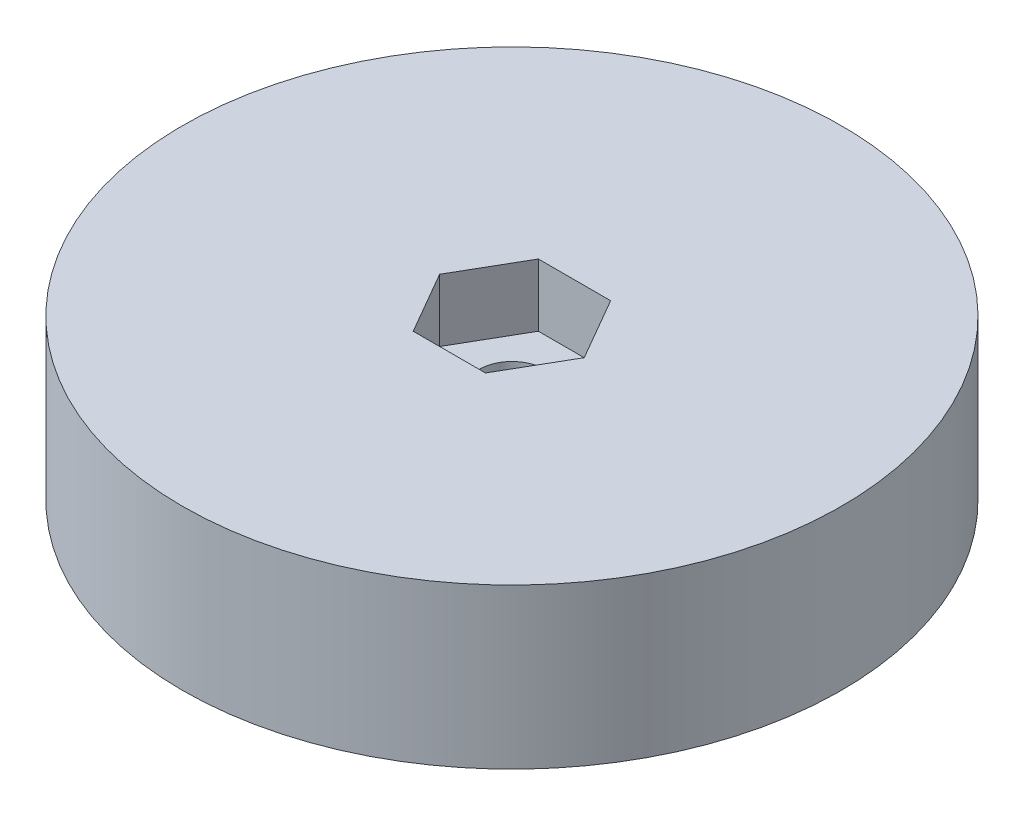
ISO-10303-21;
HEADER;
FILE_DESCRIPTION(('STEP AP214'),'2;1');
FILE_NAME('part.step','',(''),(''),'','','');
FILE_SCHEMA(('AUTOMOTIVE_DESIGN { 1 0 10303 214 1 1 1 1 }'));
ENDSEC;
DATA;
#1=APPLICATION_CONTEXT('core data for automotive mechanical design processes');
#2=APPLICATION_PROTOCOL_DEFINITION('international standard','automotive_design',2000,#1);
#3=PRODUCT_CONTEXT('',#1,'mechanical');
#4=PRODUCT('Part','Part','',(#3));
#5=PRODUCT_RELATED_PRODUCT_CATEGORY('part','',(#4));
#6=PRODUCT_DEFINITION_FORMATION('','',#4);
#7=PRODUCT_DEFINITION_CONTEXT('part definition',#1,'design');
#8=PRODUCT_DEFINITION('design','',#6,#7);
#9=PRODUCT_DEFINITION_SHAPE('','',#8);
#10=(LENGTH_UNIT() NAMED_UNIT(*) SI_UNIT(.MILLI.,.METRE.));
#11=(NAMED_UNIT(*) PLANE_ANGLE_UNIT() SI_UNIT($,.RADIAN.));
#12=(NAMED_UNIT(*) SI_UNIT($,.STERADIAN.) SOLID_ANGLE_UNIT());
#13=UNCERTAINTY_MEASURE_WITH_UNIT(LENGTH_MEASURE(1.E-05),#10,'distance_accuracy_value','');
#14=(GEOMETRIC_REPRESENTATION_CONTEXT(3) GLOBAL_UNCERTAINTY_ASSIGNED_CONTEXT((#13)) GLOBAL_UNIT_ASSIGNED_CONTEXT((#10,
#11,#12)) REPRESENTATION_CONTEXT('',''));
#15=CARTESIAN_POINT('',(0.,0.,0.));
#16=DIRECTION('',(0.,0.,1.));
#17=DIRECTION('',(1.,0.,0.));
#18=AXIS2_PLACEMENT_3D('',#15,#16,#17);
#19=CARTESIAN_POINT('',(0.,5.5,-24.));
#20=DIRECTION('',(0.,-1.,0.));
#21=DIRECTION('',(0.,0.,-1.));
#22=AXIS2_PLACEMENT_3D('',#19,#20,#21);
#23=CYLINDRICAL_SURFACE('',#22,1.5);
#24=CARTESIAN_POINT('',(0.,5.5,-24.));
#25=DIRECTION('',(0.,1.,0.));
#26=DIRECTION('',(0.,0.,1.));
#27=AXIS2_PLACEMENT_3D('',#24,#25,#26);
#28=CIRCLE('',#27,1.5);
#29=CARTESIAN_POINT('',(1.23097770997243,5.5,-24.8571428571429));
#30=VERTEX_POINT('',#29);
#31=CARTESIAN_POINT('',(-0.857142857142857,5.5,-22.7690222900276));
#32=VERTEX_POINT('',#31);
#33=EDGE_CURVE('E272',#30,#32,#28,.T.);
#34=ORIENTED_EDGE('',*,*,#33,.T.);
#35=DIRECTION('',(0.,-1.,0.));
#36=VECTOR('',#35,1.);
#37=CARTESIAN_POINT('',(-0.857142857142857,5.5,-22.7690222900276));
#38=LINE('',#37,#36);
#39=CARTESIAN_POINT('',(-0.857142857142857,0.,-22.7690222900276));
#40=VERTEX_POINT('',#39);
#41=EDGE_CURVE('E421',#32,#40,#38,.T.);
#42=ORIENTED_EDGE('',*,*,#41,.T.);
#43=CARTESIAN_POINT('',(0.,0.,-24.));
#44=DIRECTION('',(0.,1.,0.));
#45=DIRECTION('',(0.,0.,1.));
#46=AXIS2_PLACEMENT_3D('',#43,#44,#45);
#47=CIRCLE('',#46,1.5);
#48=CARTESIAN_POINT('',(1.23097770997243,0.,-24.8571428571429));
#49=VERTEX_POINT('',#48);
#50=EDGE_CURVE('E308',#49,#40,#47,.T.);
#51=ORIENTED_EDGE('',*,*,#50,.F.);
#52=DIRECTION('',(0.,-1.,0.));
#53=VECTOR('',#52,1.);
#54=CARTESIAN_POINT('',(1.23097770997244,5.5,-24.8571428571429));
#55=LINE('',#54,#53);
#56=EDGE_CURVE('E419',#49,#30,#55,.F.);
#57=ORIENTED_EDGE('',*,*,#56,.T.);
#58=EDGE_LOOP('',(#34,#42,#51,#57));
#59=FACE_BOUND('',#58,.T.);
#60=ADVANCED_FACE('F37',(#59),#23,.F.);
#61=CARTESIAN_POINT('',(0.,5.5,-24.));
#62=DIRECTION('',(0.,0.,-1.));
#63=DIRECTION('',(-1.,0.,0.));
#64=AXIS2_PLACEMENT_3D('',#61,#62,#63);
#65=PLANE('',#64);
#66=DIRECTION('',(1.,0.,0.));
#67=VECTOR('',#66,1.);
#68=CARTESIAN_POINT('',(0.,5.5,-24.));
#69=LINE('',#68,#67);
#70=CARTESIAN_POINT('',(2.87228132326901,5.5,-24.));
#71=VERTEX_POINT('',#70);
#72=CARTESIAN_POINT('',(9.75,5.5,-24.));
#73=VERTEX_POINT('',#72);
#74=EDGE_CURVE('E274',#71,#73,#69,.T.);
#75=ORIENTED_EDGE('',*,*,#74,.F.);
#76=DIRECTION('',(0.,1.,0.));
#77=VECTOR('',#76,1.);
#78=CARTESIAN_POINT('',(2.87228132326901,0.,-24.));
#79=LINE('',#78,#77);
#80=CARTESIAN_POINT('',(2.87228132326901,0.,-24.));
#81=VERTEX_POINT('',#80);
#82=EDGE_CURVE('E11',#71,#81,#79,.F.);
#83=ORIENTED_EDGE('',*,*,#82,.T.);
#84=DIRECTION('',(1.,0.,0.));
#85=VECTOR('',#84,1.);
#86=CARTESIAN_POINT('',(0.,0.,-24.));
#87=LINE('',#86,#85);
#88=CARTESIAN_POINT('',(9.75,0.,-24.));
#89=VERTEX_POINT('',#88);
#90=EDGE_CURVE('E311',#81,#89,#87,.T.);
#91=ORIENTED_EDGE('',*,*,#90,.T.);
#92=DIRECTION('',(0.,-1.,0.));
#93=VECTOR('',#92,1.);
#94=CARTESIAN_POINT('',(9.75,5.5,-24.));
#95=LINE('',#94,#93);
#96=EDGE_CURVE('E347',#73,#89,#95,.T.);
#97=ORIENTED_EDGE('',*,*,#96,.F.);
#98=EDGE_LOOP('',(#75,#83,#91,#97));
#99=FACE_BOUND('',#98,.T.);
#100=ADVANCED_FACE('F499',(#99),#65,.F.);
#101=CARTESIAN_POINT('',(9.75,5.5,0.));
#102=DIRECTION('',(-1.,0.,0.));
#103=DIRECTION('',(0.,0.,1.));
#104=AXIS2_PLACEMENT_3D('',#101,#102,#103);
#105=PLANE('',#104);
#106=DIRECTION('',(0.,0.,-1.));
#107=VECTOR('',#106,1.);
#108=CARTESIAN_POINT('',(9.75,0.,0.));
#109=LINE('',#108,#107);
#110=CARTESIAN_POINT('',(9.75,0.,-28.5));
#111=VERTEX_POINT('',#110);
#112=EDGE_CURVE('E313',#89,#111,#109,.T.);
#113=ORIENTED_EDGE('',*,*,#112,.T.);
#114=DIRECTION('',(0.,-1.,0.));
#115=VECTOR('',#114,1.);
#116=CARTESIAN_POINT('',(9.75,5.5,-28.5));
#117=LINE('',#116,#115);
#118=CARTESIAN_POINT('',(9.75,5.5,-28.5));
#119=VERTEX_POINT('',#118);
#120=EDGE_CURVE('E344',#119,#111,#117,.T.);
#121=ORIENTED_EDGE('',*,*,#120,.F.);
#122=DIRECTION('',(0.,0.,-1.));
#123=VECTOR('',#122,1.);
#124=CARTESIAN_POINT('',(9.75,5.5,0.));
#125=LINE('',#124,#123);
#126=EDGE_CURVE('E278',#73,#119,#125,.T.);
#127=ORIENTED_EDGE('',*,*,#126,.F.);
#128=ORIENTED_EDGE('',*,*,#96,.T.);
#129=EDGE_LOOP('',(#113,#121,#127,#128));
#130=FACE_BOUND('',#129,.T.);
#131=ADVANCED_FACE('F503',(#130),#105,.F.);
#132=CARTESIAN_POINT('',(0.,5.5,-28.5));
#133=DIRECTION('',(0.,0.,-1.));
#134=DIRECTION('',(-1.,0.,0.));
#135=AXIS2_PLACEMENT_3D('',#132,#133,#134);
#136=PLANE('',#135);
#137=DIRECTION('',(1.,0.,0.));
#138=VECTOR('',#137,1.);
#139=CARTESIAN_POINT('',(0.,0.,-28.5));
#140=LINE('',#139,#138);
#141=CARTESIAN_POINT('',(14.25,0.,-28.5));
#142=VERTEX_POINT('',#141);
#143=EDGE_CURVE('E316',#111,#142,#140,.T.);
#144=ORIENTED_EDGE('',*,*,#143,.T.);
#145=DIRECTION('',(0.,-1.,0.));
#146=VECTOR('',#145,1.);
#147=CARTESIAN_POINT('',(14.25,5.5,-28.5));
#148=LINE('',#147,#146);
#149=CARTESIAN_POINT('',(14.25,5.5,-28.5));
#150=VERTEX_POINT('',#149);
#151=EDGE_CURVE('E342',#150,#142,#148,.T.);
#152=ORIENTED_EDGE('',*,*,#151,.F.);
#153=DIRECTION('',(1.,0.,0.));
#154=VECTOR('',#153,1.);
#155=CARTESIAN_POINT('',(0.,5.5,-28.5));
#156=LINE('',#155,#154);
#157=EDGE_CURVE('E281',#119,#150,#156,.T.);
#158=ORIENTED_EDGE('',*,*,#157,.F.);
#159=ORIENTED_EDGE('',*,*,#120,.T.);
#160=EDGE_LOOP('',(#144,#152,#158,#159));
#161=FACE_BOUND('',#160,.T.);
#162=ADVANCED_FACE('F505',(#161),#136,.F.);
#163=CARTESIAN_POINT('',(14.25,5.5,0.));
#164=DIRECTION('',(-1.,0.,0.));
#165=DIRECTION('',(0.,0.,1.));
#166=AXIS2_PLACEMENT_3D('',#163,#164,#165);
#167=PLANE('',#166);
#168=DIRECTION('',(0.,0.,-1.));
#169=VECTOR('',#168,1.);
#170=CARTESIAN_POINT('',(14.25,0.,0.));
#171=LINE('',#170,#169);
#172=CARTESIAN_POINT('',(14.25,0.,-24.));
#173=VERTEX_POINT('',#172);
#174=EDGE_CURVE('E319',#173,#142,#171,.T.);
#175=ORIENTED_EDGE('',*,*,#174,.F.);
#176=DIRECTION('',(0.,-1.,0.));
#177=VECTOR('',#176,1.);
#178=CARTESIAN_POINT('',(14.25,5.5,-24.));
#179=LINE('',#178,#177);
#180=CARTESIAN_POINT('',(14.25,5.5,-24.));
#181=VERTEX_POINT('',#180);
#182=EDGE_CURVE('E305',#181,#173,#179,.T.);
#183=ORIENTED_EDGE('',*,*,#182,.F.);
#184=DIRECTION('',(0.,0.,-1.));
#185=VECTOR('',#184,1.);
#186=CARTESIAN_POINT('',(14.25,5.5,0.));
#187=LINE('',#186,#185);
#188=EDGE_CURVE('E284',#181,#150,#187,.T.);
#189=ORIENTED_EDGE('',*,*,#188,.T.);
#190=ORIENTED_EDGE('',*,*,#151,.T.);
#191=EDGE_LOOP('',(#175,#183,#189,#190));
#192=FACE_BOUND('',#191,.T.);
#193=ADVANCED_FACE('F439',(#192),#167,.T.);
#194=CARTESIAN_POINT('',(0.,5.5,-24.));
#195=DIRECTION('',(0.,0.,1.));
#196=DIRECTION('',(1.,0.,0.));
#197=AXIS2_PLACEMENT_3D('',#194,#195,#196);
#198=PLANE('',#197);
#199=DIRECTION('',(-1.,0.,0.));
#200=VECTOR('',#199,1.);
#201=CARTESIAN_POINT('',(0.,0.,-24.));
#202=LINE('',#201,#200);
#203=CARTESIAN_POINT('',(21.127718676731,0.,-24.));
#204=VERTEX_POINT('',#203);
#205=EDGE_CURVE('E322',#204,#173,#202,.T.);
#206=ORIENTED_EDGE('',*,*,#205,.F.);
#207=DIRECTION('',(0.,1.,0.));
#208=VECTOR('',#207,1.);
#209=CARTESIAN_POINT('',(21.127718676731,5.5,-24.));
#210=LINE('',#209,#208);
#211=CARTESIAN_POINT('',(21.127718676731,5.5,-24.));
#212=VERTEX_POINT('',#211);
#213=EDGE_CURVE('E46',#204,#212,#210,.T.);
#214=ORIENTED_EDGE('',*,*,#213,.T.);
#215=DIRECTION('',(-1.,0.,0.));
#216=VECTOR('',#215,1.);
#217=CARTESIAN_POINT('',(0.,5.5,-24.));
#218=LINE('',#217,#216);
#219=EDGE_CURVE('E287',#212,#181,#218,.T.);
#220=ORIENTED_EDGE('',*,*,#219,.T.);
#221=ORIENTED_EDGE('',*,*,#182,.T.);
#222=EDGE_LOOP('',(#206,#214,#220,#221));
#223=FACE_BOUND('',#222,.T.);
#224=ADVANCED_FACE('F428',(#223),#198,.T.);
#225=CARTESIAN_POINT('',(24.,5.5,-24.));
#226=DIRECTION('',(0.,-1.,0.));
#227=DIRECTION('',(0.,0.,-1.));
#228=AXIS2_PLACEMENT_3D('',#225,#226,#227);
#229=CYLINDRICAL_SURFACE('',#228,1.5);
#230=CARTESIAN_POINT('',(24.,0.,-24.));
#231=DIRECTION('',(0.,1.,0.));
#232=DIRECTION('',(0.,0.,1.));
#233=AXIS2_PLACEMENT_3D('',#230,#231,#232);
#234=CIRCLE('',#233,1.5);
#235=CARTESIAN_POINT('',(22.7690222900276,0.,-24.8571428571429));
#236=VERTEX_POINT('',#235);
#237=CARTESIAN_POINT('',(24.8571428571429,0.,-22.7690222900276));
#238=VERTEX_POINT('',#237);
#239=EDGE_CURVE('E324',#236,#238,#234,.F.);
#240=ORIENTED_EDGE('',*,*,#239,.T.);
#241=DIRECTION('',(0.,-1.,0.));
#242=VECTOR('',#241,1.);
#243=CARTESIAN_POINT('',(24.8571428571429,5.5,-22.7690222900276));
#244=LINE('',#243,#242);
#245=CARTESIAN_POINT('',(24.8571428571429,5.5,-22.7690222900276));
#246=VERTEX_POINT('',#245);
#247=EDGE_CURVE('E408',#238,#246,#244,.F.);
#248=ORIENTED_EDGE('',*,*,#247,.T.);
#249=CARTESIAN_POINT('',(24.,5.5,-24.));
#250=DIRECTION('',(0.,1.,0.));
#251=DIRECTION('',(0.,0.,1.));
#252=AXIS2_PLACEMENT_3D('',#249,#250,#251);
#253=CIRCLE('',#252,1.5);
#254=CARTESIAN_POINT('',(22.7690222900276,5.5,-24.8571428571429));
#255=VERTEX_POINT('',#254);
#256=EDGE_CURVE('E289',#255,#246,#253,.F.);
#257=ORIENTED_EDGE('',*,*,#256,.F.);
#258=DIRECTION('',(0.,-1.,0.));
#259=VECTOR('',#258,1.);
#260=CARTESIAN_POINT('',(22.7690222900276,5.5,-24.8571428571429));
#261=LINE('',#260,#259);
#262=EDGE_CURVE('E405',#255,#236,#261,.T.);
#263=ORIENTED_EDGE('',*,*,#262,.T.);
#264=EDGE_LOOP('',(#240,#248,#257,#263));
#265=FACE_BOUND('',#264,.T.);
#266=ADVANCED_FACE('F445',(#265),#229,.F.);
#267=CARTESIAN_POINT('',(24.,5.5,0.));
#268=DIRECTION('',(-1.,0.,0.));
#269=DIRECTION('',(0.,0.,1.));
#270=AXIS2_PLACEMENT_3D('',#267,#268,#269);
#271=PLANE('',#270);
#272=DIRECTION('',(0.,0.,-1.));
#273=VECTOR('',#272,1.);
#274=CARTESIAN_POINT('',(24.,0.,0.));
#275=LINE('',#274,#273);
#276=CARTESIAN_POINT('',(24.,0.,-2.87228132326901));
#277=VERTEX_POINT('',#276);
#278=CARTESIAN_POINT('',(24.,0.,-21.127718676731));
#279=VERTEX_POINT('',#278);
#280=EDGE_CURVE('E327',#277,#279,#275,.T.);
#281=ORIENTED_EDGE('',*,*,#280,.F.);
#282=DIRECTION('',(0.,1.,0.));
#283=VECTOR('',#282,1.);
#284=CARTESIAN_POINT('',(24.,5.5,-2.87228132326901));
#285=LINE('',#284,#283);
#286=CARTESIAN_POINT('',(24.,5.5,-2.87228132326901));
#287=VERTEX_POINT('',#286);
#288=EDGE_CURVE('E403',#277,#287,#285,.T.);
#289=ORIENTED_EDGE('',*,*,#288,.T.);
#290=DIRECTION('',(0.,0.,-1.));
#291=VECTOR('',#290,1.);
#292=CARTESIAN_POINT('',(24.,5.5,0.));
#293=LINE('',#292,#291);
#294=CARTESIAN_POINT('',(24.,5.5,-21.127718676731));
#295=VERTEX_POINT('',#294);
#296=EDGE_CURVE('E292',#287,#295,#293,.T.);
#297=ORIENTED_EDGE('',*,*,#296,.T.);
#298=DIRECTION('',(0.,1.,0.));
#299=VECTOR('',#298,1.);
#300=CARTESIAN_POINT('',(24.,0.,-21.127718676731));
#301=LINE('',#300,#299);
#302=EDGE_CURVE('E400',#295,#279,#301,.F.);
#303=ORIENTED_EDGE('',*,*,#302,.T.);
#304=EDGE_LOOP('',(#281,#289,#297,#303));
#305=FACE_BOUND('',#304,.T.);
#306=ADVANCED_FACE('F454',(#305),#271,.T.);
#307=CARTESIAN_POINT('',(24.,5.5,0.));
#308=DIRECTION('',(0.,-1.,0.));
#309=DIRECTION('',(0.,0.,-1.));
#310=AXIS2_PLACEMENT_3D('',#307,#308,#309);
#311=CYLINDRICAL_SURFACE('',#310,1.5);
#312=CARTESIAN_POINT('',(24.,0.,0.));
#313=DIRECTION('',(0.,1.,0.));
#314=DIRECTION('',(0.,0.,1.));
#315=AXIS2_PLACEMENT_3D('',#312,#313,#314);
#316=CIRCLE('',#315,1.5);
#317=CARTESIAN_POINT('',(24.8571428571429,0.,-1.23097770997243));
#318=VERTEX_POINT('',#317);
#319=CARTESIAN_POINT('',(22.7690222900276,0.,0.857142857142857));
#320=VERTEX_POINT('',#319);
#321=EDGE_CURVE('E330',#318,#320,#316,.F.);
#322=ORIENTED_EDGE('',*,*,#321,.T.);
#323=DIRECTION('',(0.,-1.,0.));
#324=VECTOR('',#323,1.);
#325=CARTESIAN_POINT('',(22.7690222900276,5.5,0.857142857142857));
#326=LINE('',#325,#324);
#327=CARTESIAN_POINT('',(22.7690222900276,5.5,0.857142857142857));
#328=VERTEX_POINT('',#327);
#329=EDGE_CURVE('E374',#320,#328,#326,.F.);
#330=ORIENTED_EDGE('',*,*,#329,.T.);
#331=CARTESIAN_POINT('',(24.,5.5,0.));
#332=DIRECTION('',(0.,1.,0.));
#333=DIRECTION('',(0.,0.,1.));
#334=AXIS2_PLACEMENT_3D('',#331,#332,#333);
#335=CIRCLE('',#334,1.5);
#336=CARTESIAN_POINT('',(24.8571428571429,5.5,-1.23097770997243));
#337=VERTEX_POINT('',#336);
#338=EDGE_CURVE('E294',#337,#328,#335,.F.);
#339=ORIENTED_EDGE('',*,*,#338,.F.);
#340=DIRECTION('',(0.,-1.,0.));
#341=VECTOR('',#340,1.);
#342=CARTESIAN_POINT('',(24.8571428571429,5.5,-1.23097770997243));
#343=LINE('',#342,#341);
#344=EDGE_CURVE('E371',#337,#318,#343,.T.);
#345=ORIENTED_EDGE('',*,*,#344,.T.);
#346=EDGE_LOOP('',(#322,#330,#339,#345));
#347=FACE_BOUND('',#346,.T.);
#348=ADVANCED_FACE('F462',(#347),#311,.F.);
#349=CARTESIAN_POINT('',(0.,5.5,0.));
#350=DIRECTION('',(0.,0.,-1.));
#351=DIRECTION('',(-1.,0.,0.));
#352=AXIS2_PLACEMENT_3D('',#349,#350,#351);
#353=PLANE('',#352);
#354=DIRECTION('',(1.,0.,0.));
#355=VECTOR('',#354,1.);
#356=CARTESIAN_POINT('',(0.,5.5,0.));
#357=LINE('',#356,#355);
#358=CARTESIAN_POINT('',(2.87228132326901,5.5,0.));
#359=VERTEX_POINT('',#358);
#360=CARTESIAN_POINT('',(21.127718676731,5.5,0.));
#361=VERTEX_POINT('',#360);
#362=EDGE_CURVE('E297',#359,#361,#357,.T.);
#363=ORIENTED_EDGE('',*,*,#362,.T.);
#364=DIRECTION('',(0.,1.,0.));
#365=VECTOR('',#364,1.);
#366=CARTESIAN_POINT('',(21.127718676731,0.,0.));
#367=LINE('',#366,#365);
#368=CARTESIAN_POINT('',(21.127718676731,0.,0.));
#369=VERTEX_POINT('',#368);
#370=EDGE_CURVE('E352',#361,#369,#367,.F.);
#371=ORIENTED_EDGE('',*,*,#370,.T.);
#372=DIRECTION('',(1.,0.,0.));
#373=VECTOR('',#372,1.);
#374=CARTESIAN_POINT('',(0.,0.,0.));
#375=LINE('',#374,#373);
#376=CARTESIAN_POINT('',(2.87228132326901,0.,0.));
#377=VERTEX_POINT('',#376);
#378=EDGE_CURVE('E333',#377,#369,#375,.T.);
#379=ORIENTED_EDGE('',*,*,#378,.F.);
#380=DIRECTION('',(0.,1.,0.));
#381=VECTOR('',#380,1.);
#382=CARTESIAN_POINT('',(2.87228132326901,5.5,0.));
#383=LINE('',#382,#381);
#384=EDGE_CURVE('E350',#377,#359,#383,.T.);
#385=ORIENTED_EDGE('',*,*,#384,.T.);
#386=EDGE_LOOP('',(#363,#371,#379,#385));
#387=FACE_BOUND('',#386,.T.);
#388=ADVANCED_FACE('F471',(#387),#353,.T.);
#389=CARTESIAN_POINT('',(0.,5.5,0.));
#390=DIRECTION('',(0.,-1.,0.));
#391=DIRECTION('',(0.,0.,-1.));
#392=AXIS2_PLACEMENT_3D('',#389,#390,#391);
#393=CYLINDRICAL_SURFACE('',#392,1.5);
#394=CARTESIAN_POINT('',(0.,0.,0.));
#395=DIRECTION('',(0.,1.,0.));
#396=DIRECTION('',(0.,0.,1.));
#397=AXIS2_PLACEMENT_3D('',#394,#395,#396);
#398=CIRCLE('',#397,1.5);
#399=CARTESIAN_POINT('',(1.23097770997243,0.,0.857142857142857));
#400=VERTEX_POINT('',#399);
#401=CARTESIAN_POINT('',(-0.857142857142857,0.,-1.23097770997243));
#402=VERTEX_POINT('',#401);
#403=EDGE_CURVE('E336',#400,#402,#398,.F.);
#404=ORIENTED_EDGE('',*,*,#403,.T.);
#405=DIRECTION('',(0.,-1.,0.));
#406=VECTOR('',#405,1.);
#407=CARTESIAN_POINT('',(-0.857142857142857,5.5,-1.23097770997243));
#408=LINE('',#407,#406);
#409=CARTESIAN_POINT('',(-0.857142857142857,5.5,-1.23097770997243));
#410=VERTEX_POINT('',#409);
#411=EDGE_CURVE('E417',#402,#410,#408,.F.);
#412=ORIENTED_EDGE('',*,*,#411,.T.);
#413=CARTESIAN_POINT('',(0.,5.5,0.));
#414=DIRECTION('',(0.,1.,0.));
#415=DIRECTION('',(0.,0.,1.));
#416=AXIS2_PLACEMENT_3D('',#413,#414,#415);
#417=CIRCLE('',#416,1.5);
#418=CARTESIAN_POINT('',(1.23097770997243,5.5,0.857142857142857));
#419=VERTEX_POINT('',#418);
#420=EDGE_CURVE('E299',#419,#410,#417,.F.);
#421=ORIENTED_EDGE('',*,*,#420,.F.);
#422=DIRECTION('',(0.,-1.,0.));
#423=VECTOR('',#422,1.);
#424=CARTESIAN_POINT('',(1.23097770997243,5.5,0.857142857142857));
#425=LINE('',#424,#423);
#426=EDGE_CURVE('E414',#419,#400,#425,.T.);
#427=ORIENTED_EDGE('',*,*,#426,.T.);
#428=EDGE_LOOP('',(#404,#412,#421,#427));
#429=FACE_BOUND('',#428,.T.);
#430=ADVANCED_FACE('F479',(#429),#393,.F.);
#431=CARTESIAN_POINT('',(12.,5.5,-12.));
#432=DIRECTION('',(0.,-1.,0.));
#433=DIRECTION('',(0.,0.,-1.));
#434=AXIS2_PLACEMENT_3D('',#431,#432,#433);
#435=CYLINDRICAL_SURFACE('',#434,22.1147575161927);
#436=CARTESIAN_POINT('',(12.,0.,-12.));
#437=DIRECTION('',(0.,1.,0.));
#438=DIRECTION('',(0.,0.,1.));
#439=AXIS2_PLACEMENT_3D('',#436,#437,#438);
#440=CIRCLE('',#439,22.1147575161927);
#441=CARTESIAN_POINT('',(12.,0.,10.1147575161927));
#442=VERTEX_POINT('',#441);
#443=EDGE_CURVE('E271',#442,#442,#440,.F.);
#444=ORIENTED_EDGE('',*,*,#443,.F.);
#445=EDGE_LOOP('',(#444));
#446=FACE_BOUND('',#445,.T.);
#447=CARTESIAN_POINT('',(12.,10.7,-12.));
#448=DIRECTION('',(0.,1.,0.));
#449=DIRECTION('',(0.,0.,1.));
#450=AXIS2_PLACEMENT_3D('',#447,#448,#449);
#451=CIRCLE('',#450,22.1147575161927);
#452=CARTESIAN_POINT('',(12.,10.7,10.1147575161927));
#453=VERTEX_POINT('',#452);
#454=EDGE_CURVE('E261',#453,#453,#451,.T.);
#455=ORIENTED_EDGE('',*,*,#454,.F.);
#456=EDGE_LOOP('',(#455));
#457=FACE_BOUND('',#456,.T.);
#458=ADVANCED_FACE('F521',(#446,#457),#435,.T.);
#459=CARTESIAN_POINT('',(0.,5.5,0.));
#460=DIRECTION('',(-1.,0.,0.));
#461=DIRECTION('',(0.,0.,1.));
#462=AXIS2_PLACEMENT_3D('',#459,#460,#461);
#463=PLANE('',#462);
#464=DIRECTION('',(0.,0.,-1.));
#465=VECTOR('',#464,1.);
#466=CARTESIAN_POINT('',(0.,5.5,0.));
#467=LINE('',#466,#465);
#468=CARTESIAN_POINT('',(0.,5.5,-2.87228132326901));
#469=VERTEX_POINT('',#468);
#470=CARTESIAN_POINT('',(0.,5.5,-21.127718676731));
#471=VERTEX_POINT('',#470);
#472=EDGE_CURVE('E302',#469,#471,#467,.T.);
#473=ORIENTED_EDGE('',*,*,#472,.F.);
#474=DIRECTION('',(0.,-1.,0.));
#475=VECTOR('',#474,1.);
#476=CARTESIAN_POINT('',(0.,5.5,-2.87228132326901));
#477=LINE('',#476,#475);
#478=CARTESIAN_POINT('',(0.,0.,-2.87228132326901));
#479=VERTEX_POINT('',#478);
#480=EDGE_CURVE('E411',#469,#479,#477,.T.);
#481=ORIENTED_EDGE('',*,*,#480,.T.);
#482=DIRECTION('',(0.,0.,-1.));
#483=VECTOR('',#482,1.);
#484=CARTESIAN_POINT('',(0.,0.,0.));
#485=LINE('',#484,#483);
#486=CARTESIAN_POINT('',(0.,0.,-21.127718676731));
#487=VERTEX_POINT('',#486);
#488=EDGE_CURVE('E275',#479,#487,#485,.T.);
#489=ORIENTED_EDGE('',*,*,#488,.T.);
#490=DIRECTION('',(0.,1.,0.));
#491=VECTOR('',#490,1.);
#492=CARTESIAN_POINT('',(0.,5.5,-21.127718676731));
#493=LINE('',#492,#491);
#494=EDGE_CURVE('E61',#487,#471,#493,.T.);
#495=ORIENTED_EDGE('',*,*,#494,.T.);
#496=EDGE_LOOP('',(#473,#481,#489,#495));
#497=FACE_BOUND('',#496,.T.);
#498=ADVANCED_FACE('F486',(#497),#463,.F.);
#499=CARTESIAN_POINT('',(0.,0.,0.));
#500=DIRECTION('',(0.,1.,0.));
#501=DIRECTION('',(0.,0.,1.));
#502=AXIS2_PLACEMENT_3D('',#499,#500,#501);
#503=PLANE('',#502);
#504=ORIENTED_EDGE('',*,*,#443,.T.);
#505=EDGE_LOOP('',(#504));
#506=FACE_BOUND('',#505,.T.);
#507=ORIENTED_EDGE('',*,*,#378,.T.);
#508=CARTESIAN_POINT('',(21.127718676731,0.,2.));
#509=DIRECTION('',(0.,1.,0.));
#510=DIRECTION('',(0.,0.,1.));
#511=AXIS2_PLACEMENT_3D('',#508,#509,#510);
#512=CIRCLE('',#511,2.);
#513=EDGE_CURVE('E369',#369,#320,#512,.F.);
#514=ORIENTED_EDGE('',*,*,#513,.T.);
#515=ORIENTED_EDGE('',*,*,#321,.F.);
#516=CARTESIAN_POINT('',(26.,0.,-2.87228132326901));
#517=DIRECTION('',(0.,1.,0.));
#518=DIRECTION('',(0.,0.,1.));
#519=AXIS2_PLACEMENT_3D('',#516,#517,#518);
#520=CIRCLE('',#519,2.);
#521=EDGE_CURVE('E367',#318,#277,#520,.F.);
#522=ORIENTED_EDGE('',*,*,#521,.T.);
#523=ORIENTED_EDGE('',*,*,#280,.T.);
#524=CARTESIAN_POINT('',(26.,0.,-21.127718676731));
#525=DIRECTION('',(0.,1.,0.));
#526=DIRECTION('',(0.,0.,1.));
#527=AXIS2_PLACEMENT_3D('',#524,#525,#526);
#528=CIRCLE('',#527,2.);
#529=EDGE_CURVE('E365',#279,#238,#528,.F.);
#530=ORIENTED_EDGE('',*,*,#529,.T.);
#531=ORIENTED_EDGE('',*,*,#239,.F.);
#532=CARTESIAN_POINT('',(21.127718676731,0.,-26.));
#533=DIRECTION('',(0.,1.,0.));
#534=DIRECTION('',(0.,0.,1.));
#535=AXIS2_PLACEMENT_3D('',#532,#533,#534);
#536=CIRCLE('',#535,2.);
#537=EDGE_CURVE('E357',#236,#204,#536,.F.);
#538=ORIENTED_EDGE('',*,*,#537,.T.);
#539=ORIENTED_EDGE('',*,*,#205,.T.);
#540=ORIENTED_EDGE('',*,*,#174,.T.);
#541=ORIENTED_EDGE('',*,*,#143,.F.);
#542=ORIENTED_EDGE('',*,*,#112,.F.);
#543=ORIENTED_EDGE('',*,*,#90,.F.);
#544=CARTESIAN_POINT('',(2.87228132326901,0.,-26.));
#545=DIRECTION('',(0.,1.,0.));
#546=DIRECTION('',(0.,0.,1.));
#547=AXIS2_PLACEMENT_3D('',#544,#545,#546);
#548=CIRCLE('',#547,2.);
#549=EDGE_CURVE('E355',#81,#49,#548,.F.);
#550=ORIENTED_EDGE('',*,*,#549,.T.);
#551=ORIENTED_EDGE('',*,*,#50,.T.);
#552=CARTESIAN_POINT('',(-2.,0.,-21.127718676731));
#553=DIRECTION('',(0.,1.,0.));
#554=DIRECTION('',(0.,0.,1.));
#555=AXIS2_PLACEMENT_3D('',#552,#553,#554);
#556=CIRCLE('',#555,2.);
#557=EDGE_CURVE('E359',#40,#487,#556,.F.);
#558=ORIENTED_EDGE('',*,*,#557,.T.);
#559=ORIENTED_EDGE('',*,*,#488,.F.);
#560=CARTESIAN_POINT('',(-2.,0.,-2.87228132326901));
#561=DIRECTION('',(0.,1.,0.));
#562=DIRECTION('',(0.,0.,1.));
#563=AXIS2_PLACEMENT_3D('',#560,#561,#562);
#564=CIRCLE('',#563,2.);
#565=EDGE_CURVE('E363',#479,#402,#564,.F.);
#566=ORIENTED_EDGE('',*,*,#565,.T.);
#567=ORIENTED_EDGE('',*,*,#403,.F.);
#568=CARTESIAN_POINT('',(2.87228132326901,0.,2.));
#569=DIRECTION('',(0.,1.,0.));
#570=DIRECTION('',(0.,0.,1.));
#571=AXIS2_PLACEMENT_3D('',#568,#569,#570);
#572=CIRCLE('',#571,2.);
#573=EDGE_CURVE('E361',#400,#377,#572,.F.);
#574=ORIENTED_EDGE('',*,*,#573,.T.);
#575=EDGE_LOOP('',(#507,#514,#515,#522,#523,#530,#531,#538,#539,#540,#541,#542,#543,#550,#551,
#558,#559,#566,#567,#574));
#576=FACE_BOUND('',#575,.T.);
#577=ADVANCED_FACE('F441',(#506,#576),#503,.F.);
#578=CARTESIAN_POINT('',(21.127718676731,5.5,2.));
#579=DIRECTION('',(0.,-1.,0.));
#580=DIRECTION('',(0.,0.,-1.));
#581=AXIS2_PLACEMENT_3D('',#578,#579,#580);
#582=CYLINDRICAL_SURFACE('',#581,2.);
#583=CARTESIAN_POINT('',(21.127718676731,5.5,2.));
#584=DIRECTION('',(0.,1.,0.));
#585=DIRECTION('',(0.,0.,1.));
#586=AXIS2_PLACEMENT_3D('',#583,#584,#585);
#587=CIRCLE('',#586,2.);
#588=EDGE_CURVE('E397',#328,#361,#587,.T.);
#589=ORIENTED_EDGE('',*,*,#588,.F.);
#590=ORIENTED_EDGE('',*,*,#329,.F.);
#591=ORIENTED_EDGE('',*,*,#513,.F.);
#592=ORIENTED_EDGE('',*,*,#370,.F.);
#593=EDGE_LOOP('',(#589,#590,#591,#592));
#594=FACE_BOUND('',#593,.T.);
#595=ADVANCED_FACE('F468',(#594),#582,.T.);
#596=CARTESIAN_POINT('',(26.,5.5,-2.87228132326901));
#597=DIRECTION('',(0.,-1.,0.));
#598=DIRECTION('',(0.,0.,-1.));
#599=AXIS2_PLACEMENT_3D('',#596,#597,#598);
#600=CYLINDRICAL_SURFACE('',#599,2.);
#601=CARTESIAN_POINT('',(26.,5.5,-2.87228132326901));
#602=DIRECTION('',(0.,1.,0.));
#603=DIRECTION('',(0.,0.,1.));
#604=AXIS2_PLACEMENT_3D('',#601,#602,#603);
#605=CIRCLE('',#604,2.);
#606=EDGE_CURVE('E394',#287,#337,#605,.T.);
#607=ORIENTED_EDGE('',*,*,#606,.F.);
#608=ORIENTED_EDGE('',*,*,#288,.F.);
#609=ORIENTED_EDGE('',*,*,#521,.F.);
#610=ORIENTED_EDGE('',*,*,#344,.F.);
#611=EDGE_LOOP('',(#607,#608,#609,#610));
#612=FACE_BOUND('',#611,.T.);
#613=ADVANCED_FACE('F459',(#612),#600,.T.);
#614=CARTESIAN_POINT('',(26.,5.5,-21.127718676731));
#615=DIRECTION('',(0.,-1.,0.));
#616=DIRECTION('',(0.,0.,-1.));
#617=AXIS2_PLACEMENT_3D('',#614,#615,#616);
#618=CYLINDRICAL_SURFACE('',#617,2.);
#619=CARTESIAN_POINT('',(26.,5.5,-21.127718676731));
#620=DIRECTION('',(0.,1.,0.));
#621=DIRECTION('',(0.,0.,1.));
#622=AXIS2_PLACEMENT_3D('',#619,#620,#621);
#623=CIRCLE('',#622,2.);
#624=EDGE_CURVE('E391',#246,#295,#623,.T.);
#625=ORIENTED_EDGE('',*,*,#624,.F.);
#626=ORIENTED_EDGE('',*,*,#247,.F.);
#627=ORIENTED_EDGE('',*,*,#529,.F.);
#628=ORIENTED_EDGE('',*,*,#302,.F.);
#629=EDGE_LOOP('',(#625,#626,#627,#628));
#630=FACE_BOUND('',#629,.T.);
#631=ADVANCED_FACE('F451',(#630),#618,.T.);
#632=CARTESIAN_POINT('',(-2.,5.5,-2.87228132326901));
#633=DIRECTION('',(0.,-1.,0.));
#634=DIRECTION('',(0.,0.,-1.));
#635=AXIS2_PLACEMENT_3D('',#632,#633,#634);
#636=CYLINDRICAL_SURFACE('',#635,2.);
#637=CARTESIAN_POINT('',(-2.,5.5,-2.87228132326901));
#638=DIRECTION('',(0.,1.,0.));
#639=DIRECTION('',(0.,0.,1.));
#640=AXIS2_PLACEMENT_3D('',#637,#638,#639);
#641=CIRCLE('',#640,2.);
#642=EDGE_CURVE('E388',#410,#469,#641,.T.);
#643=ORIENTED_EDGE('',*,*,#642,.F.);
#644=ORIENTED_EDGE('',*,*,#411,.F.);
#645=ORIENTED_EDGE('',*,*,#565,.F.);
#646=ORIENTED_EDGE('',*,*,#480,.F.);
#647=EDGE_LOOP('',(#643,#644,#645,#646));
#648=FACE_BOUND('',#647,.T.);
#649=ADVANCED_FACE('F484',(#648),#636,.T.);
#650=CARTESIAN_POINT('',(2.87228132326901,5.5,2.));
#651=DIRECTION('',(0.,-1.,0.));
#652=DIRECTION('',(0.,0.,-1.));
#653=AXIS2_PLACEMENT_3D('',#650,#651,#652);
#654=CYLINDRICAL_SURFACE('',#653,2.);
#655=CARTESIAN_POINT('',(2.87228132326901,5.5,2.));
#656=DIRECTION('',(0.,1.,0.));
#657=DIRECTION('',(0.,0.,1.));
#658=AXIS2_PLACEMENT_3D('',#655,#656,#657);
#659=CIRCLE('',#658,2.);
#660=EDGE_CURVE('E385',#359,#419,#659,.T.);
#661=ORIENTED_EDGE('',*,*,#660,.F.);
#662=ORIENTED_EDGE('',*,*,#384,.F.);
#663=ORIENTED_EDGE('',*,*,#573,.F.);
#664=ORIENTED_EDGE('',*,*,#426,.F.);
#665=EDGE_LOOP('',(#661,#662,#663,#664));
#666=FACE_BOUND('',#665,.T.);
#667=ADVANCED_FACE('F477',(#666),#654,.T.);
#668=CARTESIAN_POINT('',(-2.,5.5,-21.127718676731));
#669=DIRECTION('',(0.,-1.,0.));
#670=DIRECTION('',(0.,0.,-1.));
#671=AXIS2_PLACEMENT_3D('',#668,#669,#670);
#672=CYLINDRICAL_SURFACE('',#671,2.);
#673=CARTESIAN_POINT('',(-2.,5.5,-21.127718676731));
#674=DIRECTION('',(0.,1.,0.));
#675=DIRECTION('',(0.,0.,1.));
#676=AXIS2_PLACEMENT_3D('',#673,#674,#675);
#677=CIRCLE('',#676,2.);
#678=EDGE_CURVE('E382',#471,#32,#677,.T.);
#679=ORIENTED_EDGE('',*,*,#678,.F.);
#680=ORIENTED_EDGE('',*,*,#494,.F.);
#681=ORIENTED_EDGE('',*,*,#557,.F.);
#682=ORIENTED_EDGE('',*,*,#41,.F.);
#683=EDGE_LOOP('',(#679,#680,#681,#682));
#684=FACE_BOUND('',#683,.T.);
#685=ADVANCED_FACE('F490',(#684),#672,.T.);
#686=CARTESIAN_POINT('',(21.127718676731,5.5,-26.));
#687=DIRECTION('',(0.,-1.,0.));
#688=DIRECTION('',(0.,0.,-1.));
#689=AXIS2_PLACEMENT_3D('',#686,#687,#688);
#690=CYLINDRICAL_SURFACE('',#689,2.);
#691=CARTESIAN_POINT('',(21.127718676731,5.5,-26.));
#692=DIRECTION('',(0.,1.,0.));
#693=DIRECTION('',(0.,0.,1.));
#694=AXIS2_PLACEMENT_3D('',#691,#692,#693);
#695=CIRCLE('',#694,2.);
#696=EDGE_CURVE('E379',#212,#255,#695,.T.);
#697=ORIENTED_EDGE('',*,*,#696,.F.);
#698=ORIENTED_EDGE('',*,*,#213,.F.);
#699=ORIENTED_EDGE('',*,*,#537,.F.);
#700=ORIENTED_EDGE('',*,*,#262,.F.);
#701=EDGE_LOOP('',(#697,#698,#699,#700));
#702=FACE_BOUND('',#701,.T.);
#703=ADVANCED_FACE('F433',(#702),#690,.T.);
#704=CARTESIAN_POINT('',(2.87228132326901,5.5,-26.));
#705=DIRECTION('',(0.,-1.,0.));
#706=DIRECTION('',(0.,0.,-1.));
#707=AXIS2_PLACEMENT_3D('',#704,#705,#706);
#708=CYLINDRICAL_SURFACE('',#707,2.);
#709=CARTESIAN_POINT('',(2.87228132326901,5.5,-26.));
#710=DIRECTION('',(0.,1.,0.));
#711=DIRECTION('',(0.,0.,1.));
#712=AXIS2_PLACEMENT_3D('',#709,#710,#711);
#713=CIRCLE('',#712,2.);
#714=EDGE_CURVE('E376',#30,#71,#713,.T.);
#715=ORIENTED_EDGE('',*,*,#714,.F.);
#716=ORIENTED_EDGE('',*,*,#56,.F.);
#717=ORIENTED_EDGE('',*,*,#549,.F.);
#718=ORIENTED_EDGE('',*,*,#82,.F.);
#719=EDGE_LOOP('',(#715,#716,#717,#718));
#720=FACE_BOUND('',#719,.T.);
#721=ADVANCED_FACE('F39',(#720),#708,.T.);
#722=CARTESIAN_POINT('',(12.,5.5,-12.));
#723=DIRECTION('',(0.,1.,0.));
#724=DIRECTION('',(0.,0.,1.));
#725=AXIS2_PLACEMENT_3D('',#722,#723,#724);
#726=PLANE('',#725);
#727=CARTESIAN_POINT('',(12.,5.5,-12.));
#728=DIRECTION('',(0.,1.,0.));
#729=DIRECTION('',(0.,0.,1.));
#730=AXIS2_PLACEMENT_3D('',#727,#728,#729);
#731=CIRCLE('',#730,2.2);
#732=CARTESIAN_POINT('',(12.,5.5,-9.8));
#733=VERTEX_POINT('',#732);
#734=EDGE_CURVE('E41',#733,#733,#731,.T.);
#735=ORIENTED_EDGE('',*,*,#734,.T.);
#736=EDGE_LOOP('',(#735));
#737=FACE_BOUND('',#736,.T.);
#738=ORIENTED_EDGE('',*,*,#606,.T.);
#739=ORIENTED_EDGE('',*,*,#338,.T.);
#740=ORIENTED_EDGE('',*,*,#588,.T.);
#741=ORIENTED_EDGE('',*,*,#362,.F.);
#742=ORIENTED_EDGE('',*,*,#660,.T.);
#743=ORIENTED_EDGE('',*,*,#420,.T.);
#744=ORIENTED_EDGE('',*,*,#642,.T.);
#745=ORIENTED_EDGE('',*,*,#472,.T.);
#746=ORIENTED_EDGE('',*,*,#678,.T.);
#747=ORIENTED_EDGE('',*,*,#33,.F.);
#748=ORIENTED_EDGE('',*,*,#714,.T.);
#749=ORIENTED_EDGE('',*,*,#74,.T.);
#750=ORIENTED_EDGE('',*,*,#126,.T.);
#751=ORIENTED_EDGE('',*,*,#157,.T.);
#752=ORIENTED_EDGE('',*,*,#188,.F.);
#753=ORIENTED_EDGE('',*,*,#219,.F.);
#754=ORIENTED_EDGE('',*,*,#696,.T.);
#755=ORIENTED_EDGE('',*,*,#256,.T.);
#756=ORIENTED_EDGE('',*,*,#624,.T.);
#757=ORIENTED_EDGE('',*,*,#296,.F.);
#758=EDGE_LOOP('',(#738,#739,#740,#741,#742,#743,#744,#745,#746,#747,#748,#749,#750,#751,#752,
#753,#754,#755,#756,#757));
#759=FACE_BOUND('',#758,.T.);
#760=ADVANCED_FACE('F436',(#737,#759),#726,.F.);
#761=CARTESIAN_POINT('',(12.,10.7,-12.));
#762=DIRECTION('',(0.,1.,0.));
#763=DIRECTION('',(0.,0.,1.));
#764=AXIS2_PLACEMENT_3D('',#761,#762,#763);
#765=PLANE('',#764);
#766=DIRECTION('',(0.500000000000001,0.,-0.866025403784438));
#767=VECTOR('',#766,1.);
#768=CARTESIAN_POINT('',(14.4248711305964,10.7,-7.8));
#769=LINE('',#768,#767);
#770=CARTESIAN_POINT('',(14.4248711305964,10.7,-7.8));
#771=VERTEX_POINT('',#770);
#772=CARTESIAN_POINT('',(16.8497422611929,10.7,-12.));
#773=VERTEX_POINT('',#772);
#774=EDGE_CURVE('E53',#771,#773,#769,.T.);
#775=ORIENTED_EDGE('',*,*,#774,.F.);
#776=DIRECTION('',(1.,0.,0.));
#777=VECTOR('',#776,1.);
#778=CARTESIAN_POINT('',(9.57512886940357,10.7,-7.8));
#779=LINE('',#778,#777);
#780=CARTESIAN_POINT('',(9.57512886940357,10.7,-7.8));
#781=VERTEX_POINT('',#780);
#782=EDGE_CURVE('E233',#781,#771,#779,.T.);
#783=ORIENTED_EDGE('',*,*,#782,.F.);
#784=DIRECTION('',(0.499999999999999,0.,0.866025403784439));
#785=VECTOR('',#784,1.);
#786=CARTESIAN_POINT('',(7.15025773880714,10.7,-12.));
#787=LINE('',#786,#785);
#788=CARTESIAN_POINT('',(7.15025773880714,10.7,-12.));
#789=VERTEX_POINT('',#788);
#790=EDGE_CURVE('E236',#789,#781,#787,.T.);
#791=ORIENTED_EDGE('',*,*,#790,.F.);
#792=DIRECTION('',(-0.500000000000001,0.,0.866025403784438));
#793=VECTOR('',#792,1.);
#794=CARTESIAN_POINT('',(9.57512886940358,10.7,-16.2));
#795=LINE('',#794,#793);
#796=CARTESIAN_POINT('',(9.57512886940358,10.7,-16.2));
#797=VERTEX_POINT('',#796);
#798=EDGE_CURVE('E254',#797,#789,#795,.T.);
#799=ORIENTED_EDGE('',*,*,#798,.F.);
#800=DIRECTION('',(-1.,0.,0.));
#801=VECTOR('',#800,1.);
#802=CARTESIAN_POINT('',(14.4248711305964,10.7,-16.2));
#803=LINE('',#802,#801);
#804=CARTESIAN_POINT('',(14.4248711305964,10.7,-16.2));
#805=VERTEX_POINT('',#804);
#806=EDGE_CURVE('E251',#805,#797,#803,.T.);
#807=ORIENTED_EDGE('',*,*,#806,.F.);
#808=DIRECTION('',(-0.499999999999999,0.,-0.866025403784439));
#809=VECTOR('',#808,1.);
#810=CARTESIAN_POINT('',(16.8497422611929,10.7,-12.));
#811=LINE('',#810,#809);
#812=EDGE_CURVE('E249',#773,#805,#811,.T.);
#813=ORIENTED_EDGE('',*,*,#812,.F.);
#814=EDGE_LOOP('',(#775,#783,#791,#799,#807,#813));
#815=FACE_BOUND('',#814,.T.);
#816=ORIENTED_EDGE('',*,*,#454,.T.);
#817=EDGE_LOOP('',(#816));
#818=FACE_BOUND('',#817,.T.);
#819=ADVANCED_FACE('F543',(#815,#818),#765,.T.);
#820=CARTESIAN_POINT('',(14.4248711305964,6.5,-7.8));
#821=DIRECTION('',(0.866025403784438,0.,0.500000000000001));
#822=DIRECTION('',(0.500000000000001,0.,-0.866025403784438));
#823=AXIS2_PLACEMENT_3D('',#820,#821,#822);
#824=PLANE('',#823);
#825=ORIENTED_EDGE('',*,*,#774,.T.);
#826=DIRECTION('',(0.,1.,0.));
#827=VECTOR('',#826,1.);
#828=CARTESIAN_POINT('',(16.8497422611929,6.5,-12.));
#829=LINE('',#828,#827);
#830=CARTESIAN_POINT('',(16.8497422611929,6.5,-12.));
#831=VERTEX_POINT('',#830);
#832=EDGE_CURVE('E210',#831,#773,#829,.T.);
#833=ORIENTED_EDGE('',*,*,#832,.F.);
#834=DIRECTION('',(0.500000000000001,0.,-0.866025403784438));
#835=VECTOR('',#834,1.);
#836=CARTESIAN_POINT('',(14.4248711305964,6.5,-7.8));
#837=LINE('',#836,#835);
#838=CARTESIAN_POINT('',(14.4248711305964,6.5,-7.8));
#839=VERTEX_POINT('',#838);
#840=EDGE_CURVE('E214',#839,#831,#837,.T.);
#841=ORIENTED_EDGE('',*,*,#840,.F.);
#842=DIRECTION('',(0.,1.,0.));
#843=VECTOR('',#842,1.);
#844=CARTESIAN_POINT('',(14.4248711305964,6.5,-7.8));
#845=LINE('',#844,#843);
#846=EDGE_CURVE('E259',#839,#771,#845,.T.);
#847=ORIENTED_EDGE('',*,*,#846,.T.);
#848=EDGE_LOOP('',(#825,#833,#841,#847));
#849=FACE_BOUND('',#848,.T.);
#850=ADVANCED_FACE('F212',(#849),#824,.F.);
#851=CARTESIAN_POINT('',(9.57512886940357,6.5,-7.8));
#852=DIRECTION('',(0.,0.,1.));
#853=DIRECTION('',(1.,0.,0.));
#854=AXIS2_PLACEMENT_3D('',#851,#852,#853);
#855=PLANE('',#854);
#856=ORIENTED_EDGE('',*,*,#782,.T.);
#857=ORIENTED_EDGE('',*,*,#846,.F.);
#858=DIRECTION('',(1.,0.,0.));
#859=VECTOR('',#858,1.);
#860=CARTESIAN_POINT('',(9.57512886940357,6.5,-7.8));
#861=LINE('',#860,#859);
#862=CARTESIAN_POINT('',(9.57512886940357,6.5,-7.8));
#863=VERTEX_POINT('',#862);
#864=EDGE_CURVE('E220',#863,#839,#861,.T.);
#865=ORIENTED_EDGE('',*,*,#864,.F.);
#866=DIRECTION('',(0.,1.,0.));
#867=VECTOR('',#866,1.);
#868=CARTESIAN_POINT('',(9.57512886940357,6.5,-7.8));
#869=LINE('',#868,#867);
#870=EDGE_CURVE('E262',#863,#781,#869,.T.);
#871=ORIENTED_EDGE('',*,*,#870,.T.);
#872=EDGE_LOOP('',(#856,#857,#865,#871));
#873=FACE_BOUND('',#872,.T.);
#874=ADVANCED_FACE('F654',(#873),#855,.F.);
#875=CARTESIAN_POINT('',(7.15025773880714,6.5,-12.));
#876=DIRECTION('',(-0.866025403784439,0.,0.499999999999999));
#877=DIRECTION('',(0.499999999999999,0.,0.866025403784439));
#878=AXIS2_PLACEMENT_3D('',#875,#876,#877);
#879=PLANE('',#878);
#880=ORIENTED_EDGE('',*,*,#790,.T.);
#881=ORIENTED_EDGE('',*,*,#870,.F.);
#882=DIRECTION('',(0.499999999999999,0.,0.866025403784439));
#883=VECTOR('',#882,1.);
#884=CARTESIAN_POINT('',(7.15025773880714,6.5,-12.));
#885=LINE('',#884,#883);
#886=CARTESIAN_POINT('',(7.15025773880714,6.5,-12.));
#887=VERTEX_POINT('',#886);
#888=EDGE_CURVE('E245',#887,#863,#885,.T.);
#889=ORIENTED_EDGE('',*,*,#888,.F.);
#890=DIRECTION('',(0.,1.,0.));
#891=VECTOR('',#890,1.);
#892=CARTESIAN_POINT('',(7.15025773880714,6.5,-12.));
#893=LINE('',#892,#891);
#894=EDGE_CURVE('E264',#887,#789,#893,.T.);
#895=ORIENTED_EDGE('',*,*,#894,.T.);
#896=EDGE_LOOP('',(#880,#881,#889,#895));
#897=FACE_BOUND('',#896,.T.);
#898=ADVANCED_FACE('F662',(#897),#879,.F.);
#899=CARTESIAN_POINT('',(9.57512886940358,6.5,-16.2));
#900=DIRECTION('',(-0.866025403784438,0.,-0.500000000000001));
#901=DIRECTION('',(-0.500000000000001,0.,0.866025403784438));
#902=AXIS2_PLACEMENT_3D('',#899,#900,#901);
#903=PLANE('',#902);
#904=ORIENTED_EDGE('',*,*,#798,.T.);
#905=ORIENTED_EDGE('',*,*,#894,.F.);
#906=DIRECTION('',(-0.500000000000001,0.,0.866025403784438));
#907=VECTOR('',#906,1.);
#908=CARTESIAN_POINT('',(9.57512886940358,6.5,-16.2));
#909=LINE('',#908,#907);
#910=CARTESIAN_POINT('',(9.57512886940358,6.5,-16.2));
#911=VERTEX_POINT('',#910);
#912=EDGE_CURVE('E242',#911,#887,#909,.T.);
#913=ORIENTED_EDGE('',*,*,#912,.F.);
#914=DIRECTION('',(0.,1.,0.));
#915=VECTOR('',#914,1.);
#916=CARTESIAN_POINT('',(9.57512886940358,6.5,-16.2));
#917=LINE('',#916,#915);
#918=EDGE_CURVE('E266',#911,#797,#917,.T.);
#919=ORIENTED_EDGE('',*,*,#918,.T.);
#920=EDGE_LOOP('',(#904,#905,#913,#919));
#921=FACE_BOUND('',#920,.T.);
#922=ADVANCED_FACE('F672',(#921),#903,.F.);
#923=CARTESIAN_POINT('',(14.4248711305964,6.5,-16.2));
#924=DIRECTION('',(0.,0.,-1.));
#925=DIRECTION('',(-1.,0.,0.));
#926=AXIS2_PLACEMENT_3D('',#923,#924,#925);
#927=PLANE('',#926);
#928=ORIENTED_EDGE('',*,*,#806,.T.);
#929=ORIENTED_EDGE('',*,*,#918,.F.);
#930=DIRECTION('',(-1.,0.,0.));
#931=VECTOR('',#930,1.);
#932=CARTESIAN_POINT('',(14.4248711305964,6.5,-16.2));
#933=LINE('',#932,#931);
#934=CARTESIAN_POINT('',(14.4248711305964,6.5,-16.2));
#935=VERTEX_POINT('',#934);
#936=EDGE_CURVE('E228',#935,#911,#933,.T.);
#937=ORIENTED_EDGE('',*,*,#936,.F.);
#938=DIRECTION('',(0.,1.,0.));
#939=VECTOR('',#938,1.);
#940=CARTESIAN_POINT('',(14.4248711305964,6.5,-16.2));
#941=LINE('',#940,#939);
#942=EDGE_CURVE('E219',#935,#805,#941,.T.);
#943=ORIENTED_EDGE('',*,*,#942,.T.);
#944=EDGE_LOOP('',(#928,#929,#937,#943));
#945=FACE_BOUND('',#944,.T.);
#946=ADVANCED_FACE('F682',(#945),#927,.F.);
#947=CARTESIAN_POINT('',(16.8497422611929,6.5,-12.));
#948=DIRECTION('',(0.866025403784439,0.,-0.499999999999999));
#949=DIRECTION('',(-0.499999999999999,0.,-0.866025403784439));
#950=AXIS2_PLACEMENT_3D('',#947,#948,#949);
#951=PLANE('',#950);
#952=ORIENTED_EDGE('',*,*,#812,.T.);
#953=ORIENTED_EDGE('',*,*,#942,.F.);
#954=DIRECTION('',(-0.499999999999999,0.,-0.866025403784439));
#955=VECTOR('',#954,1.);
#956=CARTESIAN_POINT('',(16.8497422611929,6.5,-12.));
#957=LINE('',#956,#955);
#958=EDGE_CURVE('E223',#831,#935,#957,.T.);
#959=ORIENTED_EDGE('',*,*,#958,.F.);
#960=ORIENTED_EDGE('',*,*,#832,.T.);
#961=EDGE_LOOP('',(#952,#953,#959,#960));
#962=FACE_BOUND('',#961,.T.);
#963=ADVANCED_FACE('F224',(#962),#951,.F.);
#964=CARTESIAN_POINT('',(0.,6.5,0.));
#965=DIRECTION('',(0.,1.,0.));
#966=DIRECTION('',(0.,0.,1.));
#967=AXIS2_PLACEMENT_3D('',#964,#965,#966);
#968=PLANE('',#967);
#969=CARTESIAN_POINT('',(12.,6.5,-12.));
#970=DIRECTION('',(0.,1.,0.));
#971=DIRECTION('',(0.,0.,1.));
#972=AXIS2_PLACEMENT_3D('',#969,#970,#971);
#973=CIRCLE('',#972,2.2);
#974=CARTESIAN_POINT('',(12.,6.5,-9.8));
#975=VERTEX_POINT('',#974);
#976=EDGE_CURVE('E239',#975,#975,#973,.T.);
#977=ORIENTED_EDGE('',*,*,#976,.F.);
#978=EDGE_LOOP('',(#977));
#979=FACE_BOUND('',#978,.T.);
#980=ORIENTED_EDGE('',*,*,#840,.T.);
#981=ORIENTED_EDGE('',*,*,#958,.T.);
#982=ORIENTED_EDGE('',*,*,#936,.T.);
#983=ORIENTED_EDGE('',*,*,#912,.T.);
#984=ORIENTED_EDGE('',*,*,#888,.T.);
#985=ORIENTED_EDGE('',*,*,#864,.T.);
#986=EDGE_LOOP('',(#980,#981,#982,#983,#984,#985));
#987=FACE_BOUND('',#986,.T.);
#988=ADVANCED_FACE('F230',(#979,#987),#968,.T.);
#989=CARTESIAN_POINT('',(12.,2.3,-12.));
#990=DIRECTION('',(0.,1.,0.));
#991=DIRECTION('',(0.,0.,1.));
#992=AXIS2_PLACEMENT_3D('',#989,#990,#991);
#993=CYLINDRICAL_SURFACE('',#992,2.2);
#994=ORIENTED_EDGE('',*,*,#976,.T.);
#995=EDGE_LOOP('',(#994));
#996=FACE_BOUND('',#995,.T.);
#997=ORIENTED_EDGE('',*,*,#734,.F.);
#998=EDGE_LOOP('',(#997));
#999=FACE_BOUND('',#998,.T.);
#1000=ADVANCED_FACE('F712',(#996,#999),#993,.F.);
#1001=CLOSED_SHELL('',(#60,#100,#131,#162,#193,#224,#266,#306,#348,#388,#430,#458,#498,#577,
#595,#613,#631,#649,#667,#685,#703,#721,#760,#819,#850,#874,#898,#922,#946,#963,#988,#1000));
#1002=MANIFOLD_SOLID_BREP('B2',#1001);
#1003=ADVANCED_BREP_SHAPE_REPRESENTATION('',(#18,#1002),#14);
#1004=SHAPE_DEFINITION_REPRESENTATION(#9,#1003);
ENDSEC;
END-ISO-10303-21;
